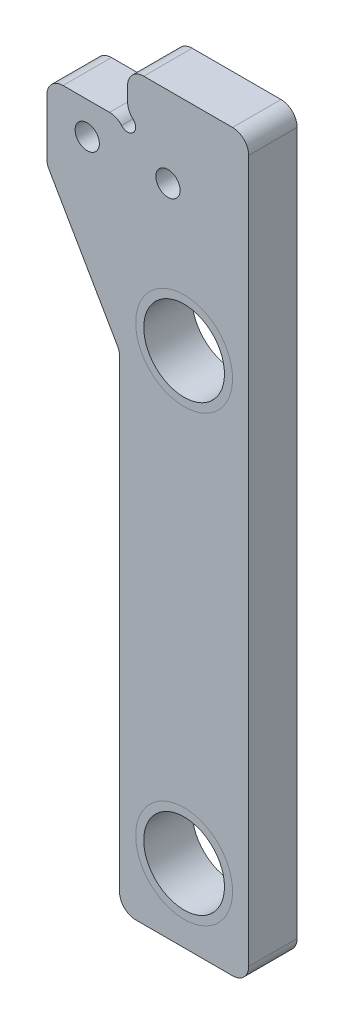
ISO-10303-21;
HEADER;
FILE_DESCRIPTION(('STEP AP214'),'2;1');
FILE_NAME('part.step','',(''),(''),'','','');
FILE_SCHEMA(('AUTOMOTIVE_DESIGN { 1 0 10303 214 1 1 1 1 }'));
ENDSEC;
DATA;
#1=APPLICATION_CONTEXT('core data for automotive mechanical design processes');
#2=APPLICATION_PROTOCOL_DEFINITION('international standard','automotive_design',2000,#1);
#3=PRODUCT_CONTEXT('',#1,'mechanical');
#4=PRODUCT('Part','Part','',(#3));
#5=PRODUCT_RELATED_PRODUCT_CATEGORY('part','',(#4));
#6=PRODUCT_DEFINITION_FORMATION('','',#4);
#7=PRODUCT_DEFINITION_CONTEXT('part definition',#1,'design');
#8=PRODUCT_DEFINITION('design','',#6,#7);
#9=PRODUCT_DEFINITION_SHAPE('','',#8);
#10=(LENGTH_UNIT() NAMED_UNIT(*) SI_UNIT(.MILLI.,.METRE.));
#11=(NAMED_UNIT(*) PLANE_ANGLE_UNIT() SI_UNIT($,.RADIAN.));
#12=(NAMED_UNIT(*) SI_UNIT($,.STERADIAN.) SOLID_ANGLE_UNIT());
#13=UNCERTAINTY_MEASURE_WITH_UNIT(LENGTH_MEASURE(1.E-05),#10,'distance_accuracy_value','');
#14=(GEOMETRIC_REPRESENTATION_CONTEXT(3) GLOBAL_UNCERTAINTY_ASSIGNED_CONTEXT((#13)) GLOBAL_UNIT_ASSIGNED_CONTEXT((#10,
#11,#12)) REPRESENTATION_CONTEXT('',''));
#15=CARTESIAN_POINT('',(0.,0.,0.));
#16=DIRECTION('',(0.,0.,1.));
#17=DIRECTION('',(1.,0.,0.));
#18=AXIS2_PLACEMENT_3D('',#15,#16,#17);
#19=CARTESIAN_POINT('',(0.,0.,0.));
#20=DIRECTION('',(0.,0.,1.));
#21=DIRECTION('',(1.,0.,0.));
#22=AXIS2_PLACEMENT_3D('',#19,#20,#21);
#23=CYLINDRICAL_SURFACE('',#22,6.);
#24=CARTESIAN_POINT('',(0.,0.,0.));
#25=DIRECTION('',(0.,0.,1.));
#26=DIRECTION('',(1.,0.,0.));
#27=AXIS2_PLACEMENT_3D('',#24,#25,#26);
#28=CIRCLE('',#27,6.);
#29=CARTESIAN_POINT('',(6.,0.,0.));
#30=VERTEX_POINT('',#29);
#31=EDGE_CURVE('E63',#30,#30,#28,.T.);
#32=ORIENTED_EDGE('',*,*,#31,.T.);
#33=EDGE_LOOP('',(#32));
#34=FACE_BOUND('',#33,.T.);
#35=CARTESIAN_POINT('',(0.,0.,6.));
#36=DIRECTION('',(0.,0.,1.));
#37=DIRECTION('',(1.,0.,0.));
#38=AXIS2_PLACEMENT_3D('',#35,#36,#37);
#39=CIRCLE('',#38,6.);
#40=CARTESIAN_POINT('',(6.,0.,6.));
#41=VERTEX_POINT('',#40);
#42=EDGE_CURVE('E61',#41,#41,#39,.T.);
#43=ORIENTED_EDGE('',*,*,#42,.F.);
#44=EDGE_LOOP('',(#43));
#45=FACE_BOUND('',#44,.T.);
#46=ADVANCED_FACE('F50',(#34,#45),#23,.T.);
#47=CARTESIAN_POINT('',(0.,0.,0.));
#48=DIRECTION('',(0.,0.,1.));
#49=DIRECTION('',(1.,0.,0.));
#50=AXIS2_PLACEMENT_3D('',#47,#48,#49);
#51=PLANE('',#50);
#52=CARTESIAN_POINT('',(0.,0.,0.));
#53=DIRECTION('',(0.,0.,1.));
#54=DIRECTION('',(1.,0.,0.));
#55=AXIS2_PLACEMENT_3D('',#52,#53,#54);
#56=CIRCLE('',#55,5.);
#57=CARTESIAN_POINT('',(5.,0.,0.));
#58=VERTEX_POINT('',#57);
#59=EDGE_CURVE('E54',#58,#58,#56,.T.);
#60=ORIENTED_EDGE('',*,*,#59,.T.);
#61=EDGE_LOOP('',(#60));
#62=FACE_BOUND('',#61,.T.);
#63=ORIENTED_EDGE('',*,*,#31,.F.);
#64=EDGE_LOOP('',(#63));
#65=FACE_BOUND('',#64,.T.);
#66=ADVANCED_FACE('F72',(#62,#65),#51,.F.);
#67=CARTESIAN_POINT('',(0.,0.,6.));
#68=DIRECTION('',(0.,0.,1.));
#69=DIRECTION('',(1.,0.,0.));
#70=AXIS2_PLACEMENT_3D('',#67,#68,#69);
#71=PLANE('',#70);
#72=CARTESIAN_POINT('',(0.,0.,6.));
#73=DIRECTION('',(0.,0.,1.));
#74=DIRECTION('',(1.,0.,0.));
#75=AXIS2_PLACEMENT_3D('',#72,#73,#74);
#76=CIRCLE('',#75,5.);
#77=CARTESIAN_POINT('',(5.,0.,6.));
#78=VERTEX_POINT('',#77);
#79=EDGE_CURVE('E11',#78,#78,#76,.T.);
#80=ORIENTED_EDGE('',*,*,#79,.F.);
#81=EDGE_LOOP('',(#80));
#82=FACE_BOUND('',#81,.T.);
#83=ORIENTED_EDGE('',*,*,#42,.T.);
#84=EDGE_LOOP('',(#83));
#85=FACE_BOUND('',#84,.T.);
#86=ADVANCED_FACE('F69',(#82,#85),#71,.T.);
#87=CARTESIAN_POINT('',(0.,0.,0.));
#88=DIRECTION('',(0.,0.,1.));
#89=DIRECTION('',(1.,0.,0.));
#90=AXIS2_PLACEMENT_3D('',#87,#88,#89);
#91=CYLINDRICAL_SURFACE('',#90,5.);
#92=ORIENTED_EDGE('',*,*,#59,.F.);
#93=EDGE_LOOP('',(#92));
#94=FACE_BOUND('',#93,.T.);
#95=ORIENTED_EDGE('',*,*,#79,.T.);
#96=EDGE_LOOP('',(#95));
#97=FACE_BOUND('',#96,.T.);
#98=ADVANCED_FACE('F52',(#94,#97),#91,.F.);
#99=CLOSED_SHELL('',(#46,#66,#86,#98));
#100=MANIFOLD_SOLID_BREP('B2',#99);
#101=CARTESIAN_POINT('',(0.,-55.,0.));
#102=DIRECTION('',(0.,0.,1.));
#103=DIRECTION('',(1.,0.,0.));
#104=AXIS2_PLACEMENT_3D('',#101,#102,#103);
#105=CYLINDRICAL_SURFACE('',#104,6.);
#106=CARTESIAN_POINT('',(0.,-55.,0.));
#107=DIRECTION('',(0.,0.,1.));
#108=DIRECTION('',(1.,0.,0.));
#109=AXIS2_PLACEMENT_3D('',#106,#107,#108);
#110=CIRCLE('',#109,6.);
#111=CARTESIAN_POINT('',(6.00000000000001,-55.,0.));
#112=VERTEX_POINT('',#111);
#113=EDGE_CURVE('E49',#112,#112,#110,.T.);
#114=ORIENTED_EDGE('',*,*,#113,.T.);
#115=EDGE_LOOP('',(#114));
#116=FACE_BOUND('',#115,.T.);
#117=CARTESIAN_POINT('',(0.,-55.,6.));
#118=DIRECTION('',(0.,0.,1.));
#119=DIRECTION('',(1.,0.,0.));
#120=AXIS2_PLACEMENT_3D('',#117,#118,#119);
#121=CIRCLE('',#120,6.);
#122=CARTESIAN_POINT('',(6.00000000000001,-55.,6.));
#123=VERTEX_POINT('',#122);
#124=EDGE_CURVE('E124',#123,#123,#121,.T.);
#125=ORIENTED_EDGE('',*,*,#124,.F.);
#126=EDGE_LOOP('',(#125));
#127=FACE_BOUND('',#126,.T.);
#128=ADVANCED_FACE('F121',(#116,#127),#105,.T.);
#129=CARTESIAN_POINT('',(0.,-55.,0.));
#130=DIRECTION('',(0.,0.,1.));
#131=DIRECTION('',(1.,0.,0.));
#132=AXIS2_PLACEMENT_3D('',#129,#130,#131);
#133=PLANE('',#132);
#134=CARTESIAN_POINT('',(0.,-55.,0.));
#135=DIRECTION('',(0.,0.,1.));
#136=DIRECTION('',(1.,0.,0.));
#137=AXIS2_PLACEMENT_3D('',#134,#135,#136);
#138=CIRCLE('',#137,5.);
#139=CARTESIAN_POINT('',(5.00000000000001,-55.,0.));
#140=VERTEX_POINT('',#139);
#141=EDGE_CURVE('E131',#140,#140,#138,.T.);
#142=ORIENTED_EDGE('',*,*,#141,.T.);
#143=EDGE_LOOP('',(#142));
#144=FACE_BOUND('',#143,.T.);
#145=ORIENTED_EDGE('',*,*,#113,.F.);
#146=EDGE_LOOP('',(#145));
#147=FACE_BOUND('',#146,.T.);
#148=ADVANCED_FACE('F139',(#144,#147),#133,.F.);
#149=CARTESIAN_POINT('',(0.,-55.,6.));
#150=DIRECTION('',(0.,0.,1.));
#151=DIRECTION('',(1.,0.,0.));
#152=AXIS2_PLACEMENT_3D('',#149,#150,#151);
#153=PLANE('',#152);
#154=CARTESIAN_POINT('',(0.,-55.,6.));
#155=DIRECTION('',(0.,0.,1.));
#156=DIRECTION('',(1.,0.,0.));
#157=AXIS2_PLACEMENT_3D('',#154,#155,#156);
#158=CIRCLE('',#157,5.);
#159=CARTESIAN_POINT('',(5.00000000000001,-55.,6.));
#160=VERTEX_POINT('',#159);
#161=EDGE_CURVE('E133',#160,#160,#158,.T.);
#162=ORIENTED_EDGE('',*,*,#161,.F.);
#163=EDGE_LOOP('',(#162));
#164=FACE_BOUND('',#163,.T.);
#165=ORIENTED_EDGE('',*,*,#124,.T.);
#166=EDGE_LOOP('',(#165));
#167=FACE_BOUND('',#166,.T.);
#168=ADVANCED_FACE('F145',(#164,#167),#153,.T.);
#169=CARTESIAN_POINT('',(0.,-55.,0.));
#170=DIRECTION('',(0.,0.,1.));
#171=DIRECTION('',(1.,0.,0.));
#172=AXIS2_PLACEMENT_3D('',#169,#170,#171);
#173=CYLINDRICAL_SURFACE('',#172,5.);
#174=ORIENTED_EDGE('',*,*,#141,.F.);
#175=EDGE_LOOP('',(#174));
#176=FACE_BOUND('',#175,.T.);
#177=ORIENTED_EDGE('',*,*,#161,.T.);
#178=EDGE_LOOP('',(#177));
#179=FACE_BOUND('',#178,.T.);
#180=ADVANCED_FACE('F142',(#176,#179),#173,.F.);
#181=CLOSED_SHELL('',(#128,#148,#168,#180));
#182=MANIFOLD_SOLID_BREP('B6',#181);
#183=CARTESIAN_POINT('',(0.,0.,6.));
#184=DIRECTION('',(0.,0.,-1.));
#185=DIRECTION('',(-1.,0.,0.));
#186=AXIS2_PLACEMENT_3D('',#183,#184,#185);
#187=PLANE('',#186);
#188=DIRECTION('',(0.,-1.,0.));
#189=VECTOR('',#188,1.);
#190=CARTESIAN_POINT('',(-17.,-35.6935909019109,6.));
#191=LINE('',#190,#189);
#192=CARTESIAN_POINT('',(-17.,18.95,6.));
#193=VERTEX_POINT('',#192);
#194=CARTESIAN_POINT('',(-17.,12.0743556529824,6.));
#195=VERTEX_POINT('',#194);
#196=EDGE_CURVE('E327',#193,#195,#191,.T.);
#197=ORIENTED_EDGE('',*,*,#196,.T.);
#198=CARTESIAN_POINT('',(-15.,12.0743556529824,6.));
#199=DIRECTION('',(0.,0.,-1.));
#200=DIRECTION('',(-1.,0.,0.));
#201=AXIS2_PLACEMENT_3D('',#198,#199,#200);
#202=CIRCLE('',#201,2.);
#203=CARTESIAN_POINT('',(-16.7320508075689,11.0743556529824,6.));
#204=VERTEX_POINT('',#203);
#205=EDGE_CURVE('E363',#195,#204,#202,.F.);
#206=ORIENTED_EDGE('',*,*,#205,.T.);
#207=DIRECTION('',(-0.499999999999995,0.866025403784442,0.));
#208=VECTOR('',#207,1.);
#209=CARTESIAN_POINT('',(-7.75370144266352,-4.47660161513771,6.));
#210=LINE('',#209,#208);
#211=CARTESIAN_POINT('',(-8.26794919243111,-3.58589838486226,6.));
#212=VERTEX_POINT('',#211);
#213=EDGE_CURVE('E418',#212,#204,#210,.T.);
#214=ORIENTED_EDGE('',*,*,#213,.F.);
#215=CARTESIAN_POINT('',(-9.99999999999999,-4.58589838486225,6.));
#216=DIRECTION('',(0.,0.,-1.));
#217=DIRECTION('',(-1.,0.,0.));
#218=AXIS2_PLACEMENT_3D('',#215,#216,#217);
#219=CIRCLE('',#218,2.);
#220=CARTESIAN_POINT('',(-7.99999999999999,-4.58589838486225,6.));
#221=VERTEX_POINT('',#220);
#222=EDGE_CURVE('E191',#212,#221,#219,.T.);
#223=ORIENTED_EDGE('',*,*,#222,.T.);
#224=DIRECTION('',(0.,1.,0.));
#225=VECTOR('',#224,1.);
#226=CARTESIAN_POINT('',(-7.99999999999999,0.,6.));
#227=LINE('',#226,#225);
#228=CARTESIAN_POINT('',(-7.99999999999999,-62.05,6.));
#229=VERTEX_POINT('',#228);
#230=EDGE_CURVE('E416',#229,#221,#227,.T.);
#231=ORIENTED_EDGE('',*,*,#230,.F.);
#232=CARTESIAN_POINT('',(-5.99999999999999,-62.05,6.));
#233=DIRECTION('',(0.,0.,-1.));
#234=DIRECTION('',(-1.,0.,0.));
#235=AXIS2_PLACEMENT_3D('',#232,#233,#234);
#236=CIRCLE('',#235,2.);
#237=CARTESIAN_POINT('',(-5.99999999999999,-64.05,6.));
#238=VERTEX_POINT('',#237);
#239=EDGE_CURVE('E351',#229,#238,#236,.F.);
#240=ORIENTED_EDGE('',*,*,#239,.T.);
#241=DIRECTION('',(1.,0.,0.));
#242=VECTOR('',#241,1.);
#243=CARTESIAN_POINT('',(8.00000000000001,-64.05,6.));
#244=LINE('',#243,#242);
#245=CARTESIAN_POINT('',(6.00000000000001,-64.05,6.));
#246=VERTEX_POINT('',#245);
#247=EDGE_CURVE('E484',#238,#246,#244,.T.);
#248=ORIENTED_EDGE('',*,*,#247,.T.);
#249=CARTESIAN_POINT('',(6.00000000000001,-62.05,6.));
#250=DIRECTION('',(0.,0.,-1.));
#251=DIRECTION('',(-1.,0.,0.));
#252=AXIS2_PLACEMENT_3D('',#249,#250,#251);
#253=CIRCLE('',#252,2.);
#254=CARTESIAN_POINT('',(8.00000000000001,-62.05,6.));
#255=VERTEX_POINT('',#254);
#256=EDGE_CURVE('E353',#246,#255,#253,.F.);
#257=ORIENTED_EDGE('',*,*,#256,.T.);
#258=DIRECTION('',(0.,1.,0.));
#259=VECTOR('',#258,1.);
#260=CARTESIAN_POINT('',(8.,20.95,6.));
#261=LINE('',#260,#259);
#262=CARTESIAN_POINT('',(8.,24.95,6.));
#263=VERTEX_POINT('',#262);
#264=EDGE_CURVE('E329',#255,#263,#261,.T.);
#265=ORIENTED_EDGE('',*,*,#264,.T.);
#266=CARTESIAN_POINT('',(6.,24.95,6.));
#267=DIRECTION('',(0.,0.,-1.));
#268=DIRECTION('',(-1.,0.,0.));
#269=AXIS2_PLACEMENT_3D('',#266,#267,#268);
#270=CIRCLE('',#269,2.);
#271=CARTESIAN_POINT('',(6.,26.95,6.));
#272=VERTEX_POINT('',#271);
#273=EDGE_CURVE('E355',#263,#272,#270,.F.);
#274=ORIENTED_EDGE('',*,*,#273,.T.);
#275=DIRECTION('',(1.,0.,0.));
#276=VECTOR('',#275,1.);
#277=CARTESIAN_POINT('',(8.00000000000001,26.95,6.));
#278=LINE('',#277,#276);
#279=CARTESIAN_POINT('',(-4.99999999999999,26.95,6.));
#280=VERTEX_POINT('',#279);
#281=EDGE_CURVE('E450',#280,#272,#278,.T.);
#282=ORIENTED_EDGE('',*,*,#281,.F.);
#283=CARTESIAN_POINT('',(-4.99999999999999,24.95,6.));
#284=DIRECTION('',(0.,0.,-1.));
#285=DIRECTION('',(-1.,0.,0.));
#286=AXIS2_PLACEMENT_3D('',#283,#284,#285);
#287=CIRCLE('',#286,2.);
#288=CARTESIAN_POINT('',(-6.99999999999999,24.95,6.));
#289=VERTEX_POINT('',#288);
#290=EDGE_CURVE('E357',#280,#289,#287,.F.);
#291=ORIENTED_EDGE('',*,*,#290,.T.);
#292=DIRECTION('',(0.,1.,0.));
#293=VECTOR('',#292,1.);
#294=CARTESIAN_POINT('',(-6.99999999999999,20.95,6.));
#295=LINE('',#294,#293);
#296=CARTESIAN_POINT('',(-6.99999999999999,23.1860679774998,6.));
#297=VERTEX_POINT('',#296);
#298=EDGE_CURVE('E447',#297,#289,#295,.T.);
#299=ORIENTED_EDGE('',*,*,#298,.F.);
#300=CARTESIAN_POINT('',(-4.99999999999999,23.1860679774998,6.));
#301=DIRECTION('',(0.,0.,-1.));
#302=DIRECTION('',(-1.,0.,0.));
#303=AXIS2_PLACEMENT_3D('',#300,#301,#302);
#304=CIRCLE('',#303,2.);
#305=CARTESIAN_POINT('',(-6.33333333333333,21.6953559924999,6.));
#306=VERTEX_POINT('',#305);
#307=EDGE_CURVE('E359',#297,#306,#304,.F.);
#308=ORIENTED_EDGE('',*,*,#307,.T.);
#309=CARTESIAN_POINT('',(-6.99999999999999,20.95,6.));
#310=DIRECTION('',(0.,0.,-1.));
#311=DIRECTION('',(-1.,0.,0.));
#312=AXIS2_PLACEMENT_3D('',#309,#310,#311);
#313=CIRCLE('',#312,1.);
#314=CARTESIAN_POINT('',(-7.74535599249992,20.2833333333333,6.));
#315=VERTEX_POINT('',#314);
#316=EDGE_CURVE('E439',#306,#315,#313,.T.);
#317=ORIENTED_EDGE('',*,*,#316,.T.);
#318=CARTESIAN_POINT('',(-9.23606797749979,18.95,6.));
#319=DIRECTION('',(0.,0.,-1.));
#320=DIRECTION('',(-1.,0.,0.));
#321=AXIS2_PLACEMENT_3D('',#318,#319,#320);
#322=CIRCLE('',#321,2.);
#323=CARTESIAN_POINT('',(-9.23606797749979,20.95,6.));
#324=VERTEX_POINT('',#323);
#325=EDGE_CURVE('E361',#315,#324,#322,.F.);
#326=ORIENTED_EDGE('',*,*,#325,.T.);
#327=DIRECTION('',(-1.,0.,0.));
#328=VECTOR('',#327,1.);
#329=CARTESIAN_POINT('',(-17.,20.95,6.));
#330=LINE('',#329,#328);
#331=CARTESIAN_POINT('',(-15.,20.95,6.));
#332=VERTEX_POINT('',#331);
#333=EDGE_CURVE('E346',#324,#332,#330,.T.);
#334=ORIENTED_EDGE('',*,*,#333,.T.);
#335=CARTESIAN_POINT('',(-15.,18.95,6.));
#336=DIRECTION('',(0.,0.,-1.));
#337=DIRECTION('',(-1.,0.,0.));
#338=AXIS2_PLACEMENT_3D('',#335,#336,#337);
#339=CIRCLE('',#338,2.);
#340=EDGE_CURVE('E349',#332,#193,#339,.F.);
#341=ORIENTED_EDGE('',*,*,#340,.T.);
#342=EDGE_LOOP('',(#197,#206,#214,#223,#231,#240,#248,#257,#265,#274,#282,#291,#299,#308,#317,
#326,#334,#341));
#343=FACE_BOUND('',#342,.T.);
#344=CARTESIAN_POINT('',(0.,0.,6.));
#345=DIRECTION('',(0.,0.,1.));
#346=DIRECTION('',(1.,0.,0.));
#347=AXIS2_PLACEMENT_3D('',#344,#345,#346);
#348=CIRCLE('',#347,6.);
#349=CARTESIAN_POINT('',(6.,0.,6.));
#350=VERTEX_POINT('',#349);
#351=EDGE_CURVE('E341',#350,#350,#348,.T.);
#352=ORIENTED_EDGE('',*,*,#351,.F.);
#353=EDGE_LOOP('',(#352));
#354=FACE_BOUND('',#353,.T.);
#355=CARTESIAN_POINT('',(0.,-55.,6.));
#356=DIRECTION('',(0.,0.,1.));
#357=DIRECTION('',(1.,0.,0.));
#358=AXIS2_PLACEMENT_3D('',#355,#356,#357);
#359=CIRCLE('',#358,6.);
#360=CARTESIAN_POINT('',(6.00000000000001,-55.,6.));
#361=VERTEX_POINT('',#360);
#362=EDGE_CURVE('E471',#361,#361,#359,.T.);
#363=ORIENTED_EDGE('',*,*,#362,.F.);
#364=EDGE_LOOP('',(#363));
#365=FACE_BOUND('',#364,.T.);
#366=CARTESIAN_POINT('',(-2.,16.95,6.));
#367=DIRECTION('',(0.,0.,1.));
#368=DIRECTION('',(1.,0.,0.));
#369=AXIS2_PLACEMENT_3D('',#366,#367,#368);
#370=CIRCLE('',#369,1.5);
#371=CARTESIAN_POINT('',(-0.5,16.95,6.));
#372=VERTEX_POINT('',#371);
#373=EDGE_CURVE('E465',#372,#372,#370,.T.);
#374=ORIENTED_EDGE('',*,*,#373,.F.);
#375=EDGE_LOOP('',(#374));
#376=FACE_BOUND('',#375,.T.);
#377=CARTESIAN_POINT('',(-12.,16.95,6.));
#378=DIRECTION('',(0.,0.,1.));
#379=DIRECTION('',(1.,0.,0.));
#380=AXIS2_PLACEMENT_3D('',#377,#378,#379);
#381=CIRCLE('',#380,1.5);
#382=CARTESIAN_POINT('',(-10.5,16.95,6.));
#383=VERTEX_POINT('',#382);
#384=EDGE_CURVE('E459',#383,#383,#381,.T.);
#385=ORIENTED_EDGE('',*,*,#384,.F.);
#386=EDGE_LOOP('',(#385));
#387=FACE_BOUND('',#386,.T.);
#388=ADVANCED_FACE('F183',(#343,#354,#365,#376,#387),#187,.F.);
#389=CARTESIAN_POINT('',(0.,0.,0.));
#390=DIRECTION('',(0.,0.,-1.));
#391=DIRECTION('',(-1.,0.,0.));
#392=AXIS2_PLACEMENT_3D('',#389,#390,#391);
#393=PLANE('',#392);
#394=DIRECTION('',(-0.499999999999995,0.866025403784442,0.));
#395=VECTOR('',#394,1.);
#396=CARTESIAN_POINT('',(-7.75370144266352,-4.47660161513771,0.));
#397=LINE('',#396,#395);
#398=CARTESIAN_POINT('',(-8.26794919243111,-3.58589838486226,0.));
#399=VERTEX_POINT('',#398);
#400=CARTESIAN_POINT('',(-16.7320508075689,11.0743556529824,0.));
#401=VERTEX_POINT('',#400);
#402=EDGE_CURVE('E431',#399,#401,#397,.T.);
#403=ORIENTED_EDGE('',*,*,#402,.T.);
#404=CARTESIAN_POINT('',(-15.,12.0743556529824,0.));
#405=DIRECTION('',(0.,0.,-1.));
#406=DIRECTION('',(-1.,0.,0.));
#407=AXIS2_PLACEMENT_3D('',#404,#405,#406);
#408=CIRCLE('',#407,2.);
#409=CARTESIAN_POINT('',(-17.,12.0743556529824,0.));
#410=VERTEX_POINT('',#409);
#411=EDGE_CURVE('E335',#401,#410,#408,.T.);
#412=ORIENTED_EDGE('',*,*,#411,.T.);
#413=DIRECTION('',(0.,-1.,0.));
#414=VECTOR('',#413,1.);
#415=CARTESIAN_POINT('',(-17.,-35.6935909019109,0.));
#416=LINE('',#415,#414);
#417=CARTESIAN_POINT('',(-17.,18.95,0.));
#418=VERTEX_POINT('',#417);
#419=EDGE_CURVE('E324',#418,#410,#416,.T.);
#420=ORIENTED_EDGE('',*,*,#419,.F.);
#421=CARTESIAN_POINT('',(-15.,18.95,0.));
#422=DIRECTION('',(0.,0.,-1.));
#423=DIRECTION('',(-1.,0.,0.));
#424=AXIS2_PLACEMENT_3D('',#421,#422,#423);
#425=CIRCLE('',#424,2.);
#426=CARTESIAN_POINT('',(-15.,20.95,0.));
#427=VERTEX_POINT('',#426);
#428=EDGE_CURVE('E308',#418,#427,#425,.T.);
#429=ORIENTED_EDGE('',*,*,#428,.T.);
#430=DIRECTION('',(-1.,0.,0.));
#431=VECTOR('',#430,1.);
#432=CARTESIAN_POINT('',(-17.,20.95,0.));
#433=LINE('',#432,#431);
#434=CARTESIAN_POINT('',(-9.23606797749979,20.95,0.));
#435=VERTEX_POINT('',#434);
#436=EDGE_CURVE('E337',#435,#427,#433,.T.);
#437=ORIENTED_EDGE('',*,*,#436,.F.);
#438=CARTESIAN_POINT('',(-9.23606797749979,18.95,0.));
#439=DIRECTION('',(0.,0.,-1.));
#440=DIRECTION('',(-1.,0.,0.));
#441=AXIS2_PLACEMENT_3D('',#438,#439,#440);
#442=CIRCLE('',#441,2.);
#443=CARTESIAN_POINT('',(-7.74535599249992,20.2833333333333,0.));
#444=VERTEX_POINT('',#443);
#445=EDGE_CURVE('E377',#435,#444,#442,.T.);
#446=ORIENTED_EDGE('',*,*,#445,.T.);
#447=CARTESIAN_POINT('',(-6.99999999999999,20.95,0.));
#448=DIRECTION('',(0.,0.,-1.));
#449=DIRECTION('',(-1.,0.,0.));
#450=AXIS2_PLACEMENT_3D('',#447,#448,#449);
#451=CIRCLE('',#450,1.);
#452=CARTESIAN_POINT('',(-6.33333333333333,21.6953559924999,0.));
#453=VERTEX_POINT('',#452);
#454=EDGE_CURVE('E436',#453,#444,#451,.T.);
#455=ORIENTED_EDGE('',*,*,#454,.F.);
#456=CARTESIAN_POINT('',(-4.99999999999999,23.1860679774998,0.));
#457=DIRECTION('',(0.,0.,-1.));
#458=DIRECTION('',(-1.,0.,0.));
#459=AXIS2_PLACEMENT_3D('',#456,#457,#458);
#460=CIRCLE('',#459,2.);
#461=CARTESIAN_POINT('',(-6.99999999999999,23.1860679774998,0.));
#462=VERTEX_POINT('',#461);
#463=EDGE_CURVE('E375',#453,#462,#460,.T.);
#464=ORIENTED_EDGE('',*,*,#463,.T.);
#465=DIRECTION('',(0.,1.,0.));
#466=VECTOR('',#465,1.);
#467=CARTESIAN_POINT('',(-6.99999999999999,20.95,0.));
#468=LINE('',#467,#466);
#469=CARTESIAN_POINT('',(-6.99999999999999,24.95,0.));
#470=VERTEX_POINT('',#469);
#471=EDGE_CURVE('E445',#462,#470,#468,.T.);
#472=ORIENTED_EDGE('',*,*,#471,.T.);
#473=CARTESIAN_POINT('',(-4.99999999999999,24.95,0.));
#474=DIRECTION('',(0.,0.,-1.));
#475=DIRECTION('',(-1.,0.,0.));
#476=AXIS2_PLACEMENT_3D('',#473,#474,#475);
#477=CIRCLE('',#476,2.);
#478=CARTESIAN_POINT('',(-4.99999999999999,26.95,0.));
#479=VERTEX_POINT('',#478);
#480=EDGE_CURVE('E373',#470,#479,#477,.T.);
#481=ORIENTED_EDGE('',*,*,#480,.T.);
#482=DIRECTION('',(1.,0.,0.));
#483=VECTOR('',#482,1.);
#484=CARTESIAN_POINT('',(8.00000000000001,26.95,0.));
#485=LINE('',#484,#483);
#486=CARTESIAN_POINT('',(6.,26.95,0.));
#487=VERTEX_POINT('',#486);
#488=EDGE_CURVE('E451',#479,#487,#485,.T.);
#489=ORIENTED_EDGE('',*,*,#488,.T.);
#490=CARTESIAN_POINT('',(6.,24.95,0.));
#491=DIRECTION('',(0.,0.,-1.));
#492=DIRECTION('',(-1.,0.,0.));
#493=AXIS2_PLACEMENT_3D('',#490,#491,#492);
#494=CIRCLE('',#493,2.);
#495=CARTESIAN_POINT('',(8.,24.95,0.));
#496=VERTEX_POINT('',#495);
#497=EDGE_CURVE('E371',#487,#496,#494,.T.);
#498=ORIENTED_EDGE('',*,*,#497,.T.);
#499=DIRECTION('',(0.,1.,0.));
#500=VECTOR('',#499,1.);
#501=CARTESIAN_POINT('',(8.,20.95,0.));
#502=LINE('',#501,#500);
#503=CARTESIAN_POINT('',(8.00000000000001,-62.05,0.));
#504=VERTEX_POINT('',#503);
#505=EDGE_CURVE('E339',#504,#496,#502,.T.);
#506=ORIENTED_EDGE('',*,*,#505,.F.);
#507=CARTESIAN_POINT('',(6.00000000000001,-62.05,0.));
#508=DIRECTION('',(0.,0.,-1.));
#509=DIRECTION('',(-1.,0.,0.));
#510=AXIS2_PLACEMENT_3D('',#507,#508,#509);
#511=CIRCLE('',#510,2.);
#512=CARTESIAN_POINT('',(6.00000000000001,-64.05,0.));
#513=VERTEX_POINT('',#512);
#514=EDGE_CURVE('E198',#504,#513,#511,.T.);
#515=ORIENTED_EDGE('',*,*,#514,.T.);
#516=DIRECTION('',(1.,0.,0.));
#517=VECTOR('',#516,1.);
#518=CARTESIAN_POINT('',(8.00000000000001,-64.05,0.));
#519=LINE('',#518,#517);
#520=CARTESIAN_POINT('',(-5.99999999999999,-64.05,0.));
#521=VERTEX_POINT('',#520);
#522=EDGE_CURVE('E336',#521,#513,#519,.T.);
#523=ORIENTED_EDGE('',*,*,#522,.F.);
#524=CARTESIAN_POINT('',(-5.99999999999999,-62.05,0.));
#525=DIRECTION('',(0.,0.,-1.));
#526=DIRECTION('',(-1.,0.,0.));
#527=AXIS2_PLACEMENT_3D('',#524,#525,#526);
#528=CIRCLE('',#527,2.);
#529=CARTESIAN_POINT('',(-7.99999999999999,-62.05,0.));
#530=VERTEX_POINT('',#529);
#531=EDGE_CURVE('E316',#521,#530,#528,.T.);
#532=ORIENTED_EDGE('',*,*,#531,.T.);
#533=DIRECTION('',(0.,1.,0.));
#534=VECTOR('',#533,1.);
#535=CARTESIAN_POINT('',(-7.99999999999999,0.,0.));
#536=LINE('',#535,#534);
#537=CARTESIAN_POINT('',(-7.99999999999999,-4.58589838486225,0.));
#538=VERTEX_POINT('',#537);
#539=EDGE_CURVE('E432',#530,#538,#536,.T.);
#540=ORIENTED_EDGE('',*,*,#539,.T.);
#541=CARTESIAN_POINT('',(-9.99999999999999,-4.58589838486225,0.));
#542=DIRECTION('',(0.,0.,-1.));
#543=DIRECTION('',(-1.,0.,0.));
#544=AXIS2_PLACEMENT_3D('',#541,#542,#543);
#545=CIRCLE('',#544,2.);
#546=EDGE_CURVE('E119',#538,#399,#545,.F.);
#547=ORIENTED_EDGE('',*,*,#546,.T.);
#548=EDGE_LOOP('',(#403,#412,#420,#429,#437,#446,#455,#464,#472,#481,#489,#498,#506,#515,#523,
#532,#540,#547));
#549=FACE_BOUND('',#548,.T.);
#550=CARTESIAN_POINT('',(-2.,16.95,0.));
#551=DIRECTION('',(0.,0.,1.));
#552=DIRECTION('',(1.,0.,0.));
#553=AXIS2_PLACEMENT_3D('',#550,#551,#552);
#554=CIRCLE('',#553,1.5);
#555=CARTESIAN_POINT('',(-0.5,16.95,0.));
#556=VERTEX_POINT('',#555);
#557=EDGE_CURVE('E462',#556,#556,#554,.T.);
#558=ORIENTED_EDGE('',*,*,#557,.T.);
#559=EDGE_LOOP('',(#558));
#560=FACE_BOUND('',#559,.T.);
#561=CARTESIAN_POINT('',(0.,0.,0.));
#562=DIRECTION('',(0.,0.,1.));
#563=DIRECTION('',(1.,0.,0.));
#564=AXIS2_PLACEMENT_3D('',#561,#562,#563);
#565=CIRCLE('',#564,6.);
#566=CARTESIAN_POINT('',(6.,0.,0.));
#567=VERTEX_POINT('',#566);
#568=EDGE_CURVE('E474',#567,#567,#565,.T.);
#569=ORIENTED_EDGE('',*,*,#568,.T.);
#570=EDGE_LOOP('',(#569));
#571=FACE_BOUND('',#570,.T.);
#572=CARTESIAN_POINT('',(0.,-55.,0.));
#573=DIRECTION('',(0.,0.,1.));
#574=DIRECTION('',(1.,0.,0.));
#575=AXIS2_PLACEMENT_3D('',#572,#573,#574);
#576=CIRCLE('',#575,6.);
#577=CARTESIAN_POINT('',(6.00000000000001,-55.,0.));
#578=VERTEX_POINT('',#577);
#579=EDGE_CURVE('E468',#578,#578,#576,.T.);
#580=ORIENTED_EDGE('',*,*,#579,.T.);
#581=EDGE_LOOP('',(#580));
#582=FACE_BOUND('',#581,.T.);
#583=CARTESIAN_POINT('',(-12.,16.95,0.));
#584=DIRECTION('',(0.,0.,1.));
#585=DIRECTION('',(1.,0.,0.));
#586=AXIS2_PLACEMENT_3D('',#583,#584,#585);
#587=CIRCLE('',#586,1.5);
#588=CARTESIAN_POINT('',(-10.5,16.95,0.));
#589=VERTEX_POINT('',#588);
#590=EDGE_CURVE('E454',#589,#589,#587,.T.);
#591=ORIENTED_EDGE('',*,*,#590,.T.);
#592=EDGE_LOOP('',(#591));
#593=FACE_BOUND('',#592,.T.);
#594=ADVANCED_FACE('F332',(#549,#560,#571,#582,#593),#393,.T.);
#595=CARTESIAN_POINT('',(-17.,20.95,6.));
#596=DIRECTION('',(0.,-1.,0.));
#597=DIRECTION('',(0.,0.,-1.));
#598=AXIS2_PLACEMENT_3D('',#595,#596,#597);
#599=PLANE('',#598);
#600=ORIENTED_EDGE('',*,*,#333,.F.);
#601=DIRECTION('',(0.,0.,-1.));
#602=VECTOR('',#601,1.);
#603=CARTESIAN_POINT('',(-9.23606797749979,20.95,6.));
#604=LINE('',#603,#602);
#605=EDGE_CURVE('E381',#324,#435,#604,.T.);
#606=ORIENTED_EDGE('',*,*,#605,.T.);
#607=ORIENTED_EDGE('',*,*,#436,.T.);
#608=DIRECTION('',(0.,0.,-1.));
#609=VECTOR('',#608,1.);
#610=CARTESIAN_POINT('',(-15.,20.95,6.));
#611=LINE('',#610,#609);
#612=EDGE_CURVE('E312',#427,#332,#611,.F.);
#613=ORIENTED_EDGE('',*,*,#612,.T.);
#614=EDGE_LOOP('',(#600,#606,#607,#613));
#615=FACE_BOUND('',#614,.T.);
#616=ADVANCED_FACE('F525',(#615),#599,.F.);
#617=CARTESIAN_POINT('',(-17.,-35.6935909019109,6.));
#618=DIRECTION('',(1.,0.,0.));
#619=DIRECTION('',(0.,0.,-1.));
#620=AXIS2_PLACEMENT_3D('',#617,#618,#619);
#621=PLANE('',#620);
#622=ORIENTED_EDGE('',*,*,#419,.T.);
#623=DIRECTION('',(0.,0.,1.));
#624=VECTOR('',#623,1.);
#625=CARTESIAN_POINT('',(-17.,12.0743556529824,6.));
#626=LINE('',#625,#624);
#627=EDGE_CURVE('E328',#410,#195,#626,.T.);
#628=ORIENTED_EDGE('',*,*,#627,.T.);
#629=ORIENTED_EDGE('',*,*,#196,.F.);
#630=DIRECTION('',(0.,0.,-1.));
#631=VECTOR('',#630,1.);
#632=CARTESIAN_POINT('',(-17.,18.95,6.));
#633=LINE('',#632,#631);
#634=EDGE_CURVE('E311',#193,#418,#633,.T.);
#635=ORIENTED_EDGE('',*,*,#634,.T.);
#636=EDGE_LOOP('',(#622,#628,#629,#635));
#637=FACE_BOUND('',#636,.T.);
#638=ADVANCED_FACE('F322',(#637),#621,.F.);
#639=CARTESIAN_POINT('',(8.00000000000001,-64.05,6.));
#640=DIRECTION('',(0.,1.,0.));
#641=DIRECTION('',(0.,0.,1.));
#642=AXIS2_PLACEMENT_3D('',#639,#640,#641);
#643=PLANE('',#642);
#644=ORIENTED_EDGE('',*,*,#522,.T.);
#645=DIRECTION('',(0.,0.,-1.));
#646=VECTOR('',#645,1.);
#647=CARTESIAN_POINT('',(6.00000000000001,-64.05,6.));
#648=LINE('',#647,#646);
#649=EDGE_CURVE('E405',#513,#246,#648,.F.);
#650=ORIENTED_EDGE('',*,*,#649,.T.);
#651=ORIENTED_EDGE('',*,*,#247,.F.);
#652=DIRECTION('',(0.,0.,1.));
#653=VECTOR('',#652,1.);
#654=CARTESIAN_POINT('',(-5.99999999999999,-64.05,6.));
#655=LINE('',#654,#653);
#656=EDGE_CURVE('E205',#238,#521,#655,.F.);
#657=ORIENTED_EDGE('',*,*,#656,.T.);
#658=EDGE_LOOP('',(#644,#650,#651,#657));
#659=FACE_BOUND('',#658,.T.);
#660=ADVANCED_FACE('F551',(#659),#643,.F.);
#661=CARTESIAN_POINT('',(8.,20.95,6.));
#662=DIRECTION('',(-1.,0.,0.));
#663=DIRECTION('',(0.,-1.,0.));
#664=AXIS2_PLACEMENT_3D('',#661,#662,#663);
#665=PLANE('',#664);
#666=ORIENTED_EDGE('',*,*,#505,.T.);
#667=DIRECTION('',(0.,0.,-1.));
#668=VECTOR('',#667,1.);
#669=CARTESIAN_POINT('',(8.,24.95,6.));
#670=LINE('',#669,#668);
#671=EDGE_CURVE('E402',#496,#263,#670,.F.);
#672=ORIENTED_EDGE('',*,*,#671,.T.);
#673=ORIENTED_EDGE('',*,*,#264,.F.);
#674=DIRECTION('',(0.,0.,-1.));
#675=VECTOR('',#674,1.);
#676=CARTESIAN_POINT('',(8.00000000000001,-62.05,6.));
#677=LINE('',#676,#675);
#678=EDGE_CURVE('E399',#255,#504,#677,.T.);
#679=ORIENTED_EDGE('',*,*,#678,.T.);
#680=EDGE_LOOP('',(#666,#672,#673,#679));
#681=FACE_BOUND('',#680,.T.);
#682=ADVANCED_FACE('F548',(#681),#665,.F.);
#683=CARTESIAN_POINT('',(0.,0.,6.));
#684=DIRECTION('',(0.,0.,-1.));
#685=DIRECTION('',(-1.,0.,0.));
#686=AXIS2_PLACEMENT_3D('',#683,#684,#685);
#687=CYLINDRICAL_SURFACE('',#686,6.);
#688=ORIENTED_EDGE('',*,*,#351,.T.);
#689=EDGE_LOOP('',(#688));
#690=FACE_BOUND('',#689,.T.);
#691=ORIENTED_EDGE('',*,*,#568,.F.);
#692=EDGE_LOOP('',(#691));
#693=FACE_BOUND('',#692,.T.);
#694=ADVANCED_FACE('F545',(#690,#693),#687,.F.);
#695=CARTESIAN_POINT('',(0.,-55.,6.));
#696=DIRECTION('',(0.,0.,-1.));
#697=DIRECTION('',(-1.,0.,0.));
#698=AXIS2_PLACEMENT_3D('',#695,#696,#697);
#699=CYLINDRICAL_SURFACE('',#698,6.);
#700=ORIENTED_EDGE('',*,*,#362,.T.);
#701=EDGE_LOOP('',(#700));
#702=FACE_BOUND('',#701,.T.);
#703=ORIENTED_EDGE('',*,*,#579,.F.);
#704=EDGE_LOOP('',(#703));
#705=FACE_BOUND('',#704,.T.);
#706=ADVANCED_FACE('F701',(#702,#705),#699,.F.);
#707=CARTESIAN_POINT('',(-2.,16.95,6.));
#708=DIRECTION('',(0.,0.,-1.));
#709=DIRECTION('',(-1.,0.,0.));
#710=AXIS2_PLACEMENT_3D('',#707,#708,#709);
#711=CYLINDRICAL_SURFACE('',#710,1.5);
#712=ORIENTED_EDGE('',*,*,#373,.T.);
#713=EDGE_LOOP('',(#712));
#714=FACE_BOUND('',#713,.T.);
#715=ORIENTED_EDGE('',*,*,#557,.F.);
#716=EDGE_LOOP('',(#715));
#717=FACE_BOUND('',#716,.T.);
#718=ADVANCED_FACE('F692',(#714,#717),#711,.F.);
#719=CARTESIAN_POINT('',(-12.,16.95,6.));
#720=DIRECTION('',(0.,0.,-1.));
#721=DIRECTION('',(-1.,0.,0.));
#722=AXIS2_PLACEMENT_3D('',#719,#720,#721);
#723=CYLINDRICAL_SURFACE('',#722,1.5);
#724=ORIENTED_EDGE('',*,*,#384,.T.);
#725=EDGE_LOOP('',(#724));
#726=FACE_BOUND('',#725,.T.);
#727=ORIENTED_EDGE('',*,*,#590,.F.);
#728=EDGE_LOOP('',(#727));
#729=FACE_BOUND('',#728,.T.);
#730=ADVANCED_FACE('F583',(#726,#729),#723,.F.);
#731=CARTESIAN_POINT('',(8.00000000000001,26.95,6.));
#732=DIRECTION('',(0.,1.,0.));
#733=DIRECTION('',(0.,0.,1.));
#734=AXIS2_PLACEMENT_3D('',#731,#732,#733);
#735=PLANE('',#734);
#736=ORIENTED_EDGE('',*,*,#488,.F.);
#737=DIRECTION('',(0.,0.,-1.));
#738=VECTOR('',#737,1.);
#739=CARTESIAN_POINT('',(-4.99999999999999,26.95,6.));
#740=LINE('',#739,#738);
#741=EDGE_CURVE('E397',#479,#280,#740,.F.);
#742=ORIENTED_EDGE('',*,*,#741,.T.);
#743=ORIENTED_EDGE('',*,*,#281,.T.);
#744=DIRECTION('',(0.,0.,-1.));
#745=VECTOR('',#744,1.);
#746=CARTESIAN_POINT('',(6.,26.95,0.));
#747=LINE('',#746,#745);
#748=EDGE_CURVE('E394',#272,#487,#747,.T.);
#749=ORIENTED_EDGE('',*,*,#748,.T.);
#750=EDGE_LOOP('',(#736,#742,#743,#749));
#751=FACE_BOUND('',#750,.T.);
#752=ADVANCED_FACE('F499',(#751),#735,.T.);
#753=CARTESIAN_POINT('',(-6.99999999999999,20.95,6.));
#754=DIRECTION('',(-1.,0.,0.));
#755=DIRECTION('',(0.,-1.,0.));
#756=AXIS2_PLACEMENT_3D('',#753,#754,#755);
#757=PLANE('',#756);
#758=ORIENTED_EDGE('',*,*,#471,.F.);
#759=DIRECTION('',(0.,0.,1.));
#760=VECTOR('',#759,1.);
#761=CARTESIAN_POINT('',(-6.99999999999999,23.1860679774998,6.));
#762=LINE('',#761,#760);
#763=EDGE_CURVE('E392',#462,#297,#762,.T.);
#764=ORIENTED_EDGE('',*,*,#763,.T.);
#765=ORIENTED_EDGE('',*,*,#298,.T.);
#766=DIRECTION('',(0.,0.,-1.));
#767=VECTOR('',#766,1.);
#768=CARTESIAN_POINT('',(-6.99999999999999,24.95,6.));
#769=LINE('',#768,#767);
#770=EDGE_CURVE('E389',#289,#470,#769,.T.);
#771=ORIENTED_EDGE('',*,*,#770,.T.);
#772=EDGE_LOOP('',(#758,#764,#765,#771));
#773=FACE_BOUND('',#772,.T.);
#774=ADVANCED_FACE('F507',(#773),#757,.T.);
#775=CARTESIAN_POINT('',(-6.99999999999999,20.95,6.));
#776=DIRECTION('',(0.,0.,-1.));
#777=DIRECTION('',(-1.,0.,0.));
#778=AXIS2_PLACEMENT_3D('',#775,#776,#777);
#779=CYLINDRICAL_SURFACE('',#778,1.);
#780=ORIENTED_EDGE('',*,*,#454,.T.);
#781=DIRECTION('',(0.,0.,-1.));
#782=VECTOR('',#781,1.);
#783=CARTESIAN_POINT('',(-7.74535599249992,20.2833333333333,6.));
#784=LINE('',#783,#782);
#785=EDGE_CURVE('E387',#444,#315,#784,.F.);
#786=ORIENTED_EDGE('',*,*,#785,.T.);
#787=ORIENTED_EDGE('',*,*,#316,.F.);
#788=DIRECTION('',(0.,0.,-1.));
#789=VECTOR('',#788,1.);
#790=CARTESIAN_POINT('',(-6.33333333333333,21.6953559924999,6.));
#791=LINE('',#790,#789);
#792=EDGE_CURVE('E384',#306,#453,#791,.T.);
#793=ORIENTED_EDGE('',*,*,#792,.T.);
#794=EDGE_LOOP('',(#780,#786,#787,#793));
#795=FACE_BOUND('',#794,.T.);
#796=ADVANCED_FACE('F517',(#795),#779,.F.);
#797=CARTESIAN_POINT('',(-7.99999999999999,0.,0.));
#798=DIRECTION('',(1.,0.,0.));
#799=DIRECTION('',(0.,0.,-1.));
#800=AXIS2_PLACEMENT_3D('',#797,#798,#799);
#801=PLANE('',#800);
#802=ORIENTED_EDGE('',*,*,#539,.F.);
#803=DIRECTION('',(0.,0.,1.));
#804=VECTOR('',#803,1.);
#805=CARTESIAN_POINT('',(-7.99999999999999,-62.05,0.));
#806=LINE('',#805,#804);
#807=EDGE_CURVE('E409',#530,#229,#806,.T.);
#808=ORIENTED_EDGE('',*,*,#807,.T.);
#809=ORIENTED_EDGE('',*,*,#230,.T.);
#810=DIRECTION('',(0.,0.,1.));
#811=VECTOR('',#810,1.);
#812=CARTESIAN_POINT('',(-7.99999999999999,-4.58589838486225,0.));
#813=LINE('',#812,#811);
#814=EDGE_CURVE('E407',#221,#538,#813,.F.);
#815=ORIENTED_EDGE('',*,*,#814,.T.);
#816=EDGE_LOOP('',(#802,#808,#809,#815));
#817=FACE_BOUND('',#816,.T.);
#818=ADVANCED_FACE('F424',(#817),#801,.F.);
#819=CARTESIAN_POINT('',(-7.75370144266352,-4.47660161513771,0.));
#820=DIRECTION('',(0.866025403784441,0.499999999999995,0.));
#821=DIRECTION('',(-0.499999999999995,0.866025403784441,0.));
#822=AXIS2_PLACEMENT_3D('',#819,#820,#821);
#823=PLANE('',#822);
#824=ORIENTED_EDGE('',*,*,#213,.T.);
#825=DIRECTION('',(0.,0.,1.));
#826=VECTOR('',#825,1.);
#827=CARTESIAN_POINT('',(-16.7320508075689,11.0743556529824,0.));
#828=LINE('',#827,#826);
#829=EDGE_CURVE('E317',#204,#401,#828,.F.);
#830=ORIENTED_EDGE('',*,*,#829,.T.);
#831=ORIENTED_EDGE('',*,*,#402,.F.);
#832=DIRECTION('',(0.,0.,1.));
#833=VECTOR('',#832,1.);
#834=CARTESIAN_POINT('',(-8.26794919243111,-3.58589838486226,6.));
#835=LINE('',#834,#833);
#836=EDGE_CURVE('E365',#399,#212,#835,.T.);
#837=ORIENTED_EDGE('',*,*,#836,.T.);
#838=EDGE_LOOP('',(#824,#830,#831,#837));
#839=FACE_BOUND('',#838,.T.);
#840=ADVANCED_FACE('F434',(#839),#823,.F.);
#841=CARTESIAN_POINT('',(-15.,12.0743556529824,6.));
#842=DIRECTION('',(0.,0.,1.));
#843=DIRECTION('',(1.,0.,0.));
#844=AXIS2_PLACEMENT_3D('',#841,#842,#843);
#845=CYLINDRICAL_SURFACE('',#844,2.);
#846=ORIENTED_EDGE('',*,*,#411,.F.);
#847=ORIENTED_EDGE('',*,*,#829,.F.);
#848=ORIENTED_EDGE('',*,*,#205,.F.);
#849=ORIENTED_EDGE('',*,*,#627,.F.);
#850=EDGE_LOOP('',(#846,#847,#848,#849));
#851=FACE_BOUND('',#850,.T.);
#852=ADVANCED_FACE('F527',(#851),#845,.T.);
#853=CARTESIAN_POINT('',(-9.23606797749979,18.95,6.));
#854=DIRECTION('',(0.,0.,-1.));
#855=DIRECTION('',(-1.,0.,0.));
#856=AXIS2_PLACEMENT_3D('',#853,#854,#855);
#857=CYLINDRICAL_SURFACE('',#856,2.);
#858=ORIENTED_EDGE('',*,*,#325,.F.);
#859=ORIENTED_EDGE('',*,*,#785,.F.);
#860=ORIENTED_EDGE('',*,*,#445,.F.);
#861=ORIENTED_EDGE('',*,*,#605,.F.);
#862=EDGE_LOOP('',(#858,#859,#860,#861));
#863=FACE_BOUND('',#862,.T.);
#864=ADVANCED_FACE('F522',(#863),#857,.T.);
#865=CARTESIAN_POINT('',(-4.99999999999999,23.1860679774998,6.));
#866=DIRECTION('',(0.,0.,-1.));
#867=DIRECTION('',(-1.,0.,0.));
#868=AXIS2_PLACEMENT_3D('',#865,#866,#867);
#869=CYLINDRICAL_SURFACE('',#868,2.);
#870=ORIENTED_EDGE('',*,*,#307,.F.);
#871=ORIENTED_EDGE('',*,*,#763,.F.);
#872=ORIENTED_EDGE('',*,*,#463,.F.);
#873=ORIENTED_EDGE('',*,*,#792,.F.);
#874=EDGE_LOOP('',(#870,#871,#872,#873));
#875=FACE_BOUND('',#874,.T.);
#876=ADVANCED_FACE('F514',(#875),#869,.T.);
#877=CARTESIAN_POINT('',(-4.99999999999999,24.95,6.));
#878=DIRECTION('',(0.,0.,-1.));
#879=DIRECTION('',(-1.,0.,0.));
#880=AXIS2_PLACEMENT_3D('',#877,#878,#879);
#881=CYLINDRICAL_SURFACE('',#880,2.);
#882=ORIENTED_EDGE('',*,*,#290,.F.);
#883=ORIENTED_EDGE('',*,*,#741,.F.);
#884=ORIENTED_EDGE('',*,*,#480,.F.);
#885=ORIENTED_EDGE('',*,*,#770,.F.);
#886=EDGE_LOOP('',(#882,#883,#884,#885));
#887=FACE_BOUND('',#886,.T.);
#888=ADVANCED_FACE('F505',(#887),#881,.T.);
#889=CARTESIAN_POINT('',(6.,24.95,6.));
#890=DIRECTION('',(0.,0.,1.));
#891=DIRECTION('',(1.,0.,0.));
#892=AXIS2_PLACEMENT_3D('',#889,#890,#891);
#893=CYLINDRICAL_SURFACE('',#892,2.);
#894=ORIENTED_EDGE('',*,*,#273,.F.);
#895=ORIENTED_EDGE('',*,*,#671,.F.);
#896=ORIENTED_EDGE('',*,*,#497,.F.);
#897=ORIENTED_EDGE('',*,*,#748,.F.);
#898=EDGE_LOOP('',(#894,#895,#896,#897));
#899=FACE_BOUND('',#898,.T.);
#900=ADVANCED_FACE('F496',(#899),#893,.T.);
#901=CARTESIAN_POINT('',(6.00000000000001,-62.05,6.));
#902=DIRECTION('',(0.,0.,-1.));
#903=DIRECTION('',(-1.,0.,0.));
#904=AXIS2_PLACEMENT_3D('',#901,#902,#903);
#905=CYLINDRICAL_SURFACE('',#904,2.);
#906=ORIENTED_EDGE('',*,*,#256,.F.);
#907=ORIENTED_EDGE('',*,*,#649,.F.);
#908=ORIENTED_EDGE('',*,*,#514,.F.);
#909=ORIENTED_EDGE('',*,*,#678,.F.);
#910=EDGE_LOOP('',(#906,#907,#908,#909));
#911=FACE_BOUND('',#910,.T.);
#912=ADVANCED_FACE('F646',(#911),#905,.T.);
#913=CARTESIAN_POINT('',(-5.99999999999999,-62.05,0.));
#914=DIRECTION('',(0.,0.,1.));
#915=DIRECTION('',(1.,0.,0.));
#916=AXIS2_PLACEMENT_3D('',#913,#914,#915);
#917=CYLINDRICAL_SURFACE('',#916,2.);
#918=ORIENTED_EDGE('',*,*,#531,.F.);
#919=ORIENTED_EDGE('',*,*,#656,.F.);
#920=ORIENTED_EDGE('',*,*,#239,.F.);
#921=ORIENTED_EDGE('',*,*,#807,.F.);
#922=EDGE_LOOP('',(#918,#919,#920,#921));
#923=FACE_BOUND('',#922,.T.);
#924=ADVANCED_FACE('F655',(#923),#917,.T.);
#925=CARTESIAN_POINT('',(-9.99999999999999,-4.58589838486225,0.));
#926=DIRECTION('',(0.,0.,-1.));
#927=DIRECTION('',(-1.,0.,0.));
#928=AXIS2_PLACEMENT_3D('',#925,#926,#927);
#929=CYLINDRICAL_SURFACE('',#928,2.);
#930=ORIENTED_EDGE('',*,*,#546,.F.);
#931=ORIENTED_EDGE('',*,*,#814,.F.);
#932=ORIENTED_EDGE('',*,*,#222,.F.);
#933=ORIENTED_EDGE('',*,*,#836,.F.);
#934=EDGE_LOOP('',(#930,#931,#932,#933));
#935=FACE_BOUND('',#934,.T.);
#936=ADVANCED_FACE('F429',(#935),#929,.F.);
#937=CARTESIAN_POINT('',(-15.,18.95,6.));
#938=DIRECTION('',(0.,0.,-1.));
#939=DIRECTION('',(-1.,0.,0.));
#940=AXIS2_PLACEMENT_3D('',#937,#938,#939);
#941=CYLINDRICAL_SURFACE('',#940,2.);
#942=ORIENTED_EDGE('',*,*,#340,.F.);
#943=ORIENTED_EDGE('',*,*,#612,.F.);
#944=ORIENTED_EDGE('',*,*,#428,.F.);
#945=ORIENTED_EDGE('',*,*,#634,.F.);
#946=EDGE_LOOP('',(#942,#943,#944,#945));
#947=FACE_BOUND('',#946,.T.);
#948=ADVANCED_FACE('F185',(#947),#941,.T.);
#949=CLOSED_SHELL('',(#388,#594,#616,#638,#660,#682,#694,#706,#718,#730,#752,#774,#796,#818,
#840,#852,#864,#876,#888,#900,#912,#924,#936,#948));
#950=MANIFOLD_SOLID_BREP('B44',#949);
#951=ADVANCED_BREP_SHAPE_REPRESENTATION('',(#18,#100,#182,#950),#14);
#952=SHAPE_DEFINITION_REPRESENTATION(#9,#951);
ENDSEC;
END-ISO-10303-21;
